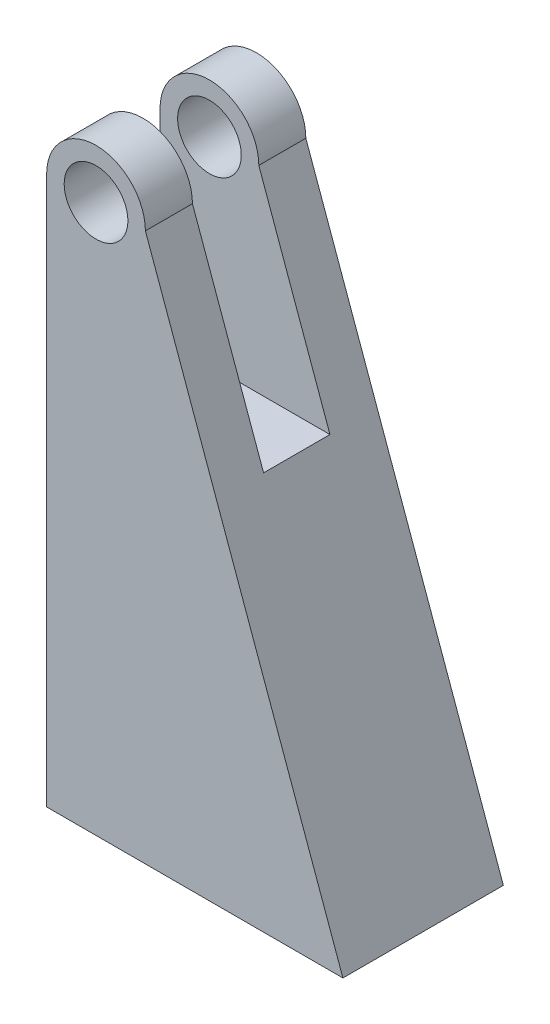
ISO-10303-21;
HEADER;
FILE_DESCRIPTION(('STEP AP214'),'2;1');
FILE_NAME('part.step','',(''),(''),'','','');
FILE_SCHEMA(('AUTOMOTIVE_DESIGN { 1 0 10303 214 1 1 1 1 }'));
ENDSEC;
DATA;
#1=APPLICATION_CONTEXT('core data for automotive mechanical design processes');
#2=APPLICATION_PROTOCOL_DEFINITION('international standard','automotive_design',2000,#1);
#3=PRODUCT_CONTEXT('',#1,'mechanical');
#4=PRODUCT('Part','Part','',(#3));
#5=PRODUCT_RELATED_PRODUCT_CATEGORY('part','',(#4));
#6=PRODUCT_DEFINITION_FORMATION('','',#4);
#7=PRODUCT_DEFINITION_CONTEXT('part definition',#1,'design');
#8=PRODUCT_DEFINITION('design','',#6,#7);
#9=PRODUCT_DEFINITION_SHAPE('','',#8);
#10=(LENGTH_UNIT() NAMED_UNIT(*) SI_UNIT(.MILLI.,.METRE.));
#11=(NAMED_UNIT(*) PLANE_ANGLE_UNIT() SI_UNIT($,.RADIAN.));
#12=(NAMED_UNIT(*) SI_UNIT($,.STERADIAN.) SOLID_ANGLE_UNIT());
#13=UNCERTAINTY_MEASURE_WITH_UNIT(LENGTH_MEASURE(1.E-05),#10,'distance_accuracy_value','');
#14=(GEOMETRIC_REPRESENTATION_CONTEXT(3) GLOBAL_UNCERTAINTY_ASSIGNED_CONTEXT((#13)) GLOBAL_UNIT_ASSIGNED_CONTEXT((#10,
#11,#12)) REPRESENTATION_CONTEXT('',''));
#15=CARTESIAN_POINT('',(0.,0.,0.));
#16=DIRECTION('',(0.,0.,1.));
#17=DIRECTION('',(1.,0.,0.));
#18=AXIS2_PLACEMENT_3D('',#15,#16,#17);
#19=CARTESIAN_POINT('',(0.,12.759375,-0.158383869367765));
#20=DIRECTION('',(0.,0.,1.));
#21=DIRECTION('',(1.,0.,0.));
#22=AXIS2_PLACEMENT_3D('',#19,#20,#21);
#23=CYLINDRICAL_SURFACE('',#22,5.);
#24=CARTESIAN_POINT('',(0.,12.759375,4.60411613063223));
#25=DIRECTION('',(0.,0.,-1.));
#26=DIRECTION('',(0.,1.,0.));
#27=AXIS2_PLACEMENT_3D('',#24,#25,#26);
#28=CIRCLE('',#27,5.);
#29=CARTESIAN_POINT('',(-5.,12.759375,4.60411613063223));
#30=VERTEX_POINT('',#29);
#31=CARTESIAN_POINT('',(5.,12.759375,4.60411613063223));
#32=VERTEX_POINT('',#31);
#33=EDGE_CURVE('E105',#30,#32,#28,.T.);
#34=ORIENTED_EDGE('',*,*,#33,.T.);
#35=DIRECTION('',(0.,0.,1.));
#36=VECTOR('',#35,1.);
#37=CARTESIAN_POINT('',(5.,12.759375,-0.158383869367765));
#38=LINE('',#37,#36);
#39=CARTESIAN_POINT('',(5.,12.759375,-0.158383869367765));
#40=VERTEX_POINT('',#39);
#41=EDGE_CURVE('E151',#40,#32,#38,.T.);
#42=ORIENTED_EDGE('',*,*,#41,.F.);
#43=CARTESIAN_POINT('',(0.,12.759375,-0.158383869367765));
#44=DIRECTION('',(0.,0.,1.));
#45=DIRECTION('',(1.,0.,0.));
#46=AXIS2_PLACEMENT_3D('',#43,#44,#45);
#47=CIRCLE('',#46,5.);
#48=CARTESIAN_POINT('',(-5.,12.759375,-0.158383869367765));
#49=VERTEX_POINT('',#48);
#50=EDGE_CURVE('E57',#49,#40,#47,.F.);
#51=ORIENTED_EDGE('',*,*,#50,.F.);
#52=DIRECTION('',(0.,0.,1.));
#53=VECTOR('',#52,1.);
#54=CARTESIAN_POINT('',(-5.,12.759375,-0.158383869367765));
#55=LINE('',#54,#53);
#56=EDGE_CURVE('E148',#49,#30,#55,.T.);
#57=ORIENTED_EDGE('',*,*,#56,.T.);
#58=EDGE_LOOP('',(#34,#42,#51,#57));
#59=FACE_BOUND('',#58,.T.);
#60=ADVANCED_FACE('F33',(#59),#23,.T.);
#61=CARTESIAN_POINT('',(-5.,0.,-0.158383869367765));
#62=DIRECTION('',(1.,0.,0.));
#63=DIRECTION('',(0.,0.,-1.));
#64=AXIS2_PLACEMENT_3D('',#61,#62,#63);
#65=PLANE('',#64);
#66=DIRECTION('',(0.,0.,1.));
#67=VECTOR('',#66,1.);
#68=CARTESIAN_POINT('',(-5.,-7.240625,4.60411613063224));
#69=LINE('',#68,#67);
#70=CARTESIAN_POINT('',(-5.,-7.240625,4.60411613063224));
#71=VERTEX_POINT('',#70);
#72=CARTESIAN_POINT('',(-5.,-7.240625,11.325));
#73=VERTEX_POINT('',#72);
#74=EDGE_CURVE('E109',#71,#73,#69,.T.);
#75=ORIENTED_EDGE('',*,*,#74,.F.);
#76=DIRECTION('',(0.,-1.,0.));
#77=VECTOR('',#76,1.);
#78=CARTESIAN_POINT('',(-5.,17.759375,4.60411613063223));
#79=LINE('',#78,#77);
#80=EDGE_CURVE('E100',#30,#71,#79,.T.);
#81=ORIENTED_EDGE('',*,*,#80,.F.);
#82=ORIENTED_EDGE('',*,*,#56,.F.);
#83=DIRECTION('',(0.,1.,0.));
#84=VECTOR('',#83,1.);
#85=CARTESIAN_POINT('',(-5.,0.,-0.158383869367765));
#86=LINE('',#85,#84);
#87=CARTESIAN_POINT('',(-5.,-42.759375,-0.158383869367765));
#88=VERTEX_POINT('',#87);
#89=EDGE_CURVE('E140',#88,#49,#86,.T.);
#90=ORIENTED_EDGE('',*,*,#89,.F.);
#91=DIRECTION('',(0.,0.,1.));
#92=VECTOR('',#91,1.);
#93=CARTESIAN_POINT('',(-5.,-42.759375,-0.158383869367765));
#94=LINE('',#93,#92);
#95=CARTESIAN_POINT('',(-5.,-42.759375,16.0875));
#96=VERTEX_POINT('',#95);
#97=EDGE_CURVE('E147',#88,#96,#94,.T.);
#98=ORIENTED_EDGE('',*,*,#97,.T.);
#99=DIRECTION('',(0.,1.,0.));
#100=VECTOR('',#99,1.);
#101=CARTESIAN_POINT('',(-5.,0.,16.0875));
#102=LINE('',#101,#100);
#103=CARTESIAN_POINT('',(-5.,12.759375,16.0875));
#104=VERTEX_POINT('',#103);
#105=EDGE_CURVE('E128',#96,#104,#102,.T.);
#106=ORIENTED_EDGE('',*,*,#105,.T.);
#107=CARTESIAN_POINT('',(-5.,12.759375,11.325));
#108=VERTEX_POINT('',#107);
#109=EDGE_CURVE('E150',#108,#104,#55,.T.);
#110=ORIENTED_EDGE('',*,*,#109,.F.);
#111=DIRECTION('',(0.,1.,0.));
#112=VECTOR('',#111,1.);
#113=CARTESIAN_POINT('',(-5.,17.759375,11.325));
#114=LINE('',#113,#112);
#115=EDGE_CURVE('E116',#73,#108,#114,.T.);
#116=ORIENTED_EDGE('',*,*,#115,.F.);
#117=EDGE_LOOP('',(#75,#81,#82,#90,#98,#106,#110,#116));
#118=FACE_BOUND('',#117,.T.);
#119=ADVANCED_FACE('F35',(#118),#65,.F.);
#120=CARTESIAN_POINT('',(0.,12.759375,11.325));
#121=DIRECTION('',(0.,0.,1.));
#122=DIRECTION('',(0.,-1.,0.));
#123=AXIS2_PLACEMENT_3D('',#120,#121,#122);
#124=CIRCLE('',#123,5.);
#125=CARTESIAN_POINT('',(5.,12.759375,11.325));
#126=VERTEX_POINT('',#125);
#127=EDGE_CURVE('E124',#126,#108,#124,.T.);
#128=ORIENTED_EDGE('',*,*,#127,.T.);
#129=ORIENTED_EDGE('',*,*,#109,.T.);
#130=CARTESIAN_POINT('',(0.,12.759375,16.0875));
#131=DIRECTION('',(0.,0.,1.));
#132=DIRECTION('',(1.,0.,0.));
#133=AXIS2_PLACEMENT_3D('',#130,#131,#132);
#134=CIRCLE('',#133,5.);
#135=CARTESIAN_POINT('',(5.,12.759375,16.0875));
#136=VERTEX_POINT('',#135);
#137=EDGE_CURVE('E137',#104,#136,#134,.F.);
#138=ORIENTED_EDGE('',*,*,#137,.T.);
#139=EDGE_CURVE('E154',#126,#136,#38,.T.);
#140=ORIENTED_EDGE('',*,*,#139,.F.);
#141=EDGE_LOOP('',(#128,#129,#138,#140));
#142=FACE_BOUND('',#141,.T.);
#143=ADVANCED_FACE('F166',(#142),#23,.T.);
#144=CARTESIAN_POINT('',(8.49412187230114,3.05991106510905,-0.158383869367765));
#145=DIRECTION('',(-0.94081583279992,-0.338918233137425,0.));
#146=DIRECTION('',(0.338918233137425,-0.94081583279992,0.));
#147=AXIS2_PLACEMENT_3D('',#144,#145,#146);
#148=PLANE('',#147);
#149=ORIENTED_EDGE('',*,*,#41,.T.);
#150=DIRECTION('',(0.338918233137425,-0.94081583279992,0.));
#151=VECTOR('',#150,1.);
#152=CARTESIAN_POINT('',(8.49412187230114,3.05991106510905,4.60411613063223));
#153=LINE('',#152,#151);
#154=CARTESIAN_POINT('',(12.20477316222,-7.240625,4.60411613063224));
#155=VERTEX_POINT('',#154);
#156=EDGE_CURVE('E11',#32,#155,#153,.T.);
#157=ORIENTED_EDGE('',*,*,#156,.T.);
#158=DIRECTION('',(0.,0.,1.));
#159=VECTOR('',#158,1.);
#160=CARTESIAN_POINT('',(12.20477316222,-7.240625,-0.158383869367765));
#161=LINE('',#160,#159);
#162=CARTESIAN_POINT('',(12.20477316222,-7.240625,11.325));
#163=VERTEX_POINT('',#162);
#164=EDGE_CURVE('E115',#155,#163,#161,.T.);
#165=ORIENTED_EDGE('',*,*,#164,.T.);
#166=DIRECTION('',(-0.338918233137425,0.94081583279992,0.));
#167=VECTOR('',#166,1.);
#168=CARTESIAN_POINT('',(8.49412187230114,3.05991106510905,11.325));
#169=LINE('',#168,#167);
#170=EDGE_CURVE('E42',#163,#126,#169,.T.);
#171=ORIENTED_EDGE('',*,*,#170,.T.);
#172=ORIENTED_EDGE('',*,*,#139,.T.);
#173=DIRECTION('',(0.338918233137425,-0.94081583279992,0.));
#174=VECTOR('',#173,1.);
#175=CARTESIAN_POINT('',(8.49412187230114,3.05991106510905,16.0875));
#176=LINE('',#175,#174);
#177=CARTESIAN_POINT('',(25.,-42.759375,16.0875));
#178=VERTEX_POINT('',#177);
#179=EDGE_CURVE('E134',#136,#178,#176,.T.);
#180=ORIENTED_EDGE('',*,*,#179,.T.);
#181=DIRECTION('',(0.,0.,1.));
#182=VECTOR('',#181,1.);
#183=CARTESIAN_POINT('',(25.,-42.759375,-0.158383869367765));
#184=LINE('',#183,#182);
#185=CARTESIAN_POINT('',(25.,-42.759375,-0.158383869367765));
#186=VERTEX_POINT('',#185);
#187=EDGE_CURVE('E155',#186,#178,#184,.T.);
#188=ORIENTED_EDGE('',*,*,#187,.F.);
#189=DIRECTION('',(0.338918233137425,-0.94081583279992,0.));
#190=VECTOR('',#189,1.);
#191=CARTESIAN_POINT('',(8.49412187230114,3.05991106510905,-0.158383869367765));
#192=LINE('',#191,#190);
#193=EDGE_CURVE('E144',#40,#186,#192,.T.);
#194=ORIENTED_EDGE('',*,*,#193,.F.);
#195=EDGE_LOOP('',(#149,#157,#165,#171,#172,#180,#188,#194));
#196=FACE_BOUND('',#195,.T.);
#197=ADVANCED_FACE('F162',(#196),#148,.F.);
#198=CARTESIAN_POINT('',(0.,-42.759375,-0.158383869367765));
#199=DIRECTION('',(0.,1.,0.));
#200=DIRECTION('',(-1.,0.,0.));
#201=AXIS2_PLACEMENT_3D('',#198,#199,#200);
#202=PLANE('',#201);
#203=ORIENTED_EDGE('',*,*,#187,.T.);
#204=DIRECTION('',(-1.,0.,0.));
#205=VECTOR('',#204,1.);
#206=CARTESIAN_POINT('',(0.,-42.759375,16.0875));
#207=LINE('',#206,#205);
#208=EDGE_CURVE('E131',#178,#96,#207,.T.);
#209=ORIENTED_EDGE('',*,*,#208,.T.);
#210=ORIENTED_EDGE('',*,*,#97,.F.);
#211=DIRECTION('',(-1.,0.,0.));
#212=VECTOR('',#211,1.);
#213=CARTESIAN_POINT('',(0.,-42.759375,-0.158383869367765));
#214=LINE('',#213,#212);
#215=EDGE_CURVE('E142',#186,#88,#214,.T.);
#216=ORIENTED_EDGE('',*,*,#215,.F.);
#217=EDGE_LOOP('',(#203,#209,#210,#216));
#218=FACE_BOUND('',#217,.T.);
#219=ADVANCED_FACE('F177',(#218),#202,.F.);
#220=CARTESIAN_POINT('',(0.,0.,-0.158383869367765));
#221=DIRECTION('',(0.,0.,1.));
#222=DIRECTION('',(1.,0.,0.));
#223=AXIS2_PLACEMENT_3D('',#220,#221,#222);
#224=PLANE('',#223);
#225=CARTESIAN_POINT('',(0.,12.759375,-0.158383869367765));
#226=DIRECTION('',(0.,0.,-1.));
#227=DIRECTION('',(-1.,0.,0.));
#228=AXIS2_PLACEMENT_3D('',#225,#226,#227);
#229=CIRCLE('',#228,3.225);
#230=CARTESIAN_POINT('',(-3.225,12.759375,-0.158383869367765));
#231=VERTEX_POINT('',#230);
#232=EDGE_CURVE('E225',#231,#231,#229,.T.);
#233=ORIENTED_EDGE('',*,*,#232,.F.);
#234=EDGE_LOOP('',(#233));
#235=FACE_BOUND('',#234,.T.);
#236=ORIENTED_EDGE('',*,*,#89,.T.);
#237=ORIENTED_EDGE('',*,*,#50,.T.);
#238=ORIENTED_EDGE('',*,*,#193,.T.);
#239=ORIENTED_EDGE('',*,*,#215,.T.);
#240=EDGE_LOOP('',(#236,#237,#238,#239));
#241=FACE_BOUND('',#240,.T.);
#242=ADVANCED_FACE('F180',(#235,#241),#224,.F.);
#243=CARTESIAN_POINT('',(0.,0.,16.0875));
#244=DIRECTION('',(0.,0.,1.));
#245=DIRECTION('',(1.,0.,0.));
#246=AXIS2_PLACEMENT_3D('',#243,#244,#245);
#247=PLANE('',#246);
#248=CARTESIAN_POINT('',(0.,12.759375,16.0875));
#249=DIRECTION('',(0.,0.,-1.));
#250=DIRECTION('',(-1.,0.,0.));
#251=AXIS2_PLACEMENT_3D('',#248,#249,#250);
#252=CIRCLE('',#251,3.225);
#253=CARTESIAN_POINT('',(-3.225,12.759375,16.0875));
#254=VERTEX_POINT('',#253);
#255=EDGE_CURVE('E229',#254,#254,#252,.T.);
#256=ORIENTED_EDGE('',*,*,#255,.T.);
#257=EDGE_LOOP('',(#256));
#258=FACE_BOUND('',#257,.T.);
#259=ORIENTED_EDGE('',*,*,#105,.F.);
#260=ORIENTED_EDGE('',*,*,#208,.F.);
#261=ORIENTED_EDGE('',*,*,#179,.F.);
#262=ORIENTED_EDGE('',*,*,#137,.F.);
#263=EDGE_LOOP('',(#259,#260,#261,#262));
#264=FACE_BOUND('',#263,.T.);
#265=ADVANCED_FACE('F170',(#258,#264),#247,.T.);
#266=CARTESIAN_POINT('',(25.,17.759375,4.60411613063223));
#267=DIRECTION('',(0.,0.,-1.));
#268=DIRECTION('',(0.,1.,0.));
#269=AXIS2_PLACEMENT_3D('',#266,#267,#268);
#270=PLANE('',#269);
#271=CARTESIAN_POINT('',(0.,12.759375,4.60411613063223));
#272=DIRECTION('',(0.,0.,-1.));
#273=DIRECTION('',(0.,1.,0.));
#274=AXIS2_PLACEMENT_3D('',#271,#272,#273);
#275=CIRCLE('',#274,3.225);
#276=CARTESIAN_POINT('',(0.,15.984375,4.60411613063223));
#277=VERTEX_POINT('',#276);
#278=EDGE_CURVE('E110',#277,#277,#275,.T.);
#279=ORIENTED_EDGE('',*,*,#278,.T.);
#280=EDGE_LOOP('',(#279));
#281=FACE_BOUND('',#280,.T.);
#282=ORIENTED_EDGE('',*,*,#80,.T.);
#283=DIRECTION('',(-1.,0.,0.));
#284=VECTOR('',#283,1.);
#285=CARTESIAN_POINT('',(25.,-7.240625,4.60411613063224));
#286=LINE('',#285,#284);
#287=EDGE_CURVE('E104',#155,#71,#286,.T.);
#288=ORIENTED_EDGE('',*,*,#287,.F.);
#289=ORIENTED_EDGE('',*,*,#156,.F.);
#290=ORIENTED_EDGE('',*,*,#33,.F.);
#291=EDGE_LOOP('',(#282,#288,#289,#290));
#292=FACE_BOUND('',#291,.T.);
#293=ADVANCED_FACE('F102',(#281,#292),#270,.F.);
#294=CARTESIAN_POINT('',(25.,17.759375,11.325));
#295=DIRECTION('',(0.,0.,1.));
#296=DIRECTION('',(0.,-1.,0.));
#297=AXIS2_PLACEMENT_3D('',#294,#295,#296);
#298=PLANE('',#297);
#299=CARTESIAN_POINT('',(0.,12.759375,11.325));
#300=DIRECTION('',(0.,0.,1.));
#301=DIRECTION('',(0.,-1.,0.));
#302=AXIS2_PLACEMENT_3D('',#299,#300,#301);
#303=CIRCLE('',#302,3.225);
#304=CARTESIAN_POINT('',(0.,9.534375,11.325));
#305=VERTEX_POINT('',#304);
#306=EDGE_CURVE('E37',#305,#305,#303,.T.);
#307=ORIENTED_EDGE('',*,*,#306,.T.);
#308=EDGE_LOOP('',(#307));
#309=FACE_BOUND('',#308,.T.);
#310=ORIENTED_EDGE('',*,*,#127,.F.);
#311=ORIENTED_EDGE('',*,*,#170,.F.);
#312=DIRECTION('',(-1.,0.,0.));
#313=VECTOR('',#312,1.);
#314=CARTESIAN_POINT('',(25.,-7.240625,11.325));
#315=LINE('',#314,#313);
#316=EDGE_CURVE('E49',#163,#73,#315,.T.);
#317=ORIENTED_EDGE('',*,*,#316,.T.);
#318=ORIENTED_EDGE('',*,*,#115,.T.);
#319=EDGE_LOOP('',(#310,#311,#317,#318));
#320=FACE_BOUND('',#319,.T.);
#321=ADVANCED_FACE('F208',(#309,#320),#298,.F.);
#322=CARTESIAN_POINT('',(25.,-7.240625,4.60411613063224));
#323=DIRECTION('',(0.,-1.,0.));
#324=DIRECTION('',(0.,0.,-1.));
#325=AXIS2_PLACEMENT_3D('',#322,#323,#324);
#326=PLANE('',#325);
#327=ORIENTED_EDGE('',*,*,#287,.T.);
#328=ORIENTED_EDGE('',*,*,#74,.T.);
#329=ORIENTED_EDGE('',*,*,#316,.F.);
#330=ORIENTED_EDGE('',*,*,#164,.F.);
#331=EDGE_LOOP('',(#327,#328,#329,#330));
#332=FACE_BOUND('',#331,.T.);
#333=ADVANCED_FACE('F112',(#332),#326,.F.);
#334=CARTESIAN_POINT('',(0.,12.759375,16.0875));
#335=DIRECTION('',(0.,0.,-1.));
#336=DIRECTION('',(-1.,0.,0.));
#337=AXIS2_PLACEMENT_3D('',#334,#335,#336);
#338=CYLINDRICAL_SURFACE('',#337,3.225);
#339=ORIENTED_EDGE('',*,*,#255,.F.);
#340=EDGE_LOOP('',(#339));
#341=FACE_BOUND('',#340,.T.);
#342=ORIENTED_EDGE('',*,*,#306,.F.);
#343=EDGE_LOOP('',(#342));
#344=FACE_BOUND('',#343,.T.);
#345=ADVANCED_FACE('F212',(#341,#344),#338,.F.);
#346=ORIENTED_EDGE('',*,*,#232,.T.);
#347=EDGE_LOOP('',(#346));
#348=FACE_BOUND('',#347,.T.);
#349=ORIENTED_EDGE('',*,*,#278,.F.);
#350=EDGE_LOOP('',(#349));
#351=FACE_BOUND('',#350,.T.);
#352=ADVANCED_FACE('F216',(#348,#351),#338,.F.);
#353=CLOSED_SHELL('',(#60,#119,#143,#197,#219,#242,#265,#293,#321,#333,#345,#352));
#354=MANIFOLD_SOLID_BREP('B2',#353);
#355=ADVANCED_BREP_SHAPE_REPRESENTATION('',(#18,#354),#14);
#356=SHAPE_DEFINITION_REPRESENTATION(#9,#355);
ENDSEC;
END-ISO-10303-21;
